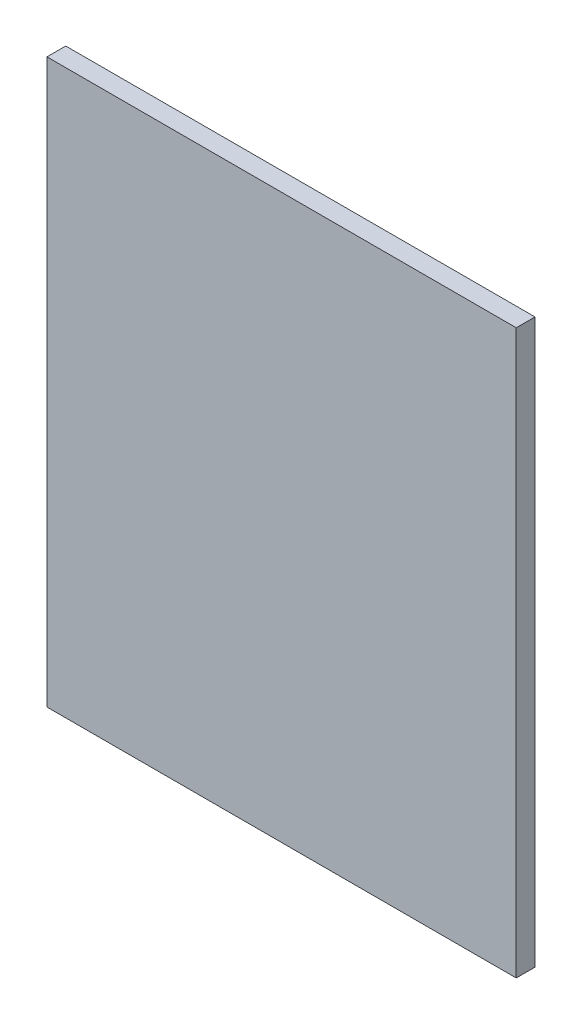
ISO-10303-21;
HEADER;
FILE_DESCRIPTION(('STEP AP214'),'2;1');
FILE_NAME('part.step','',(''),(''),'','','');
FILE_SCHEMA(('AUTOMOTIVE_DESIGN { 1 0 10303 214 1 1 1 1 }'));
ENDSEC;
DATA;
#1=APPLICATION_CONTEXT('core data for automotive mechanical design processes');
#2=APPLICATION_PROTOCOL_DEFINITION('international standard','automotive_design',2000,#1);
#3=PRODUCT_CONTEXT('',#1,'mechanical');
#4=PRODUCT('Part','Part','',(#3));
#5=PRODUCT_RELATED_PRODUCT_CATEGORY('part','',(#4));
#6=PRODUCT_DEFINITION_FORMATION('','',#4);
#7=PRODUCT_DEFINITION_CONTEXT('part definition',#1,'design');
#8=PRODUCT_DEFINITION('design','',#6,#7);
#9=PRODUCT_DEFINITION_SHAPE('','',#8);
#10=(LENGTH_UNIT() NAMED_UNIT(*) SI_UNIT(.MILLI.,.METRE.));
#11=(NAMED_UNIT(*) PLANE_ANGLE_UNIT() SI_UNIT($,.RADIAN.));
#12=(NAMED_UNIT(*) SI_UNIT($,.STERADIAN.) SOLID_ANGLE_UNIT());
#13=UNCERTAINTY_MEASURE_WITH_UNIT(LENGTH_MEASURE(1.E-05),#10,'distance_accuracy_value','');
#14=(GEOMETRIC_REPRESENTATION_CONTEXT(3) GLOBAL_UNCERTAINTY_ASSIGNED_CONTEXT((#13)) GLOBAL_UNIT_ASSIGNED_CONTEXT((#10,
#11,#12)) REPRESENTATION_CONTEXT('',''));
#15=CARTESIAN_POINT('',(0.,0.,0.));
#16=DIRECTION('',(0.,0.,1.));
#17=DIRECTION('',(1.,0.,0.));
#18=AXIS2_PLACEMENT_3D('',#15,#16,#17);
#19=CARTESIAN_POINT('',(0.3,0.15,0.6));
#20=DIRECTION('',(0.,0.,1.));
#21=DIRECTION('',(1.,0.,0.));
#22=AXIS2_PLACEMENT_3D('',#19,#20,#21);
#23=PLANE('',#22);
#24=DIRECTION('',(0.,1.,0.));
#25=VECTOR('',#24,1.);
#26=CARTESIAN_POINT('',(0.55,0.15,0.6));
#27=LINE('',#26,#25);
#28=CARTESIAN_POINT('',(0.55,0.15,0.6));
#29=VERTEX_POINT('',#28);
#30=CARTESIAN_POINT('',(0.55,-0.15,0.6));
#31=VERTEX_POINT('',#30);
#32=EDGE_CURVE('E52',#29,#31,#27,.F.);
#33=ORIENTED_EDGE('',*,*,#32,.F.);
#34=DIRECTION('',(1.,0.,0.));
#35=VECTOR('',#34,1.);
#36=CARTESIAN_POINT('',(0.3,0.15,0.6));
#37=LINE('',#36,#35);
#38=CARTESIAN_POINT('',(0.3,0.15,0.6));
#39=VERTEX_POINT('',#38);
#40=EDGE_CURVE('E67',#39,#29,#37,.T.);
#41=ORIENTED_EDGE('',*,*,#40,.F.);
#42=DIRECTION('',(0.,1.,0.));
#43=VECTOR('',#42,1.);
#44=CARTESIAN_POINT('',(0.3,-0.15,0.6));
#45=LINE('',#44,#43);
#46=CARTESIAN_POINT('',(0.3,-0.15,0.6));
#47=VERTEX_POINT('',#46);
#48=EDGE_CURVE('E19',#47,#39,#45,.T.);
#49=ORIENTED_EDGE('',*,*,#48,.F.);
#50=DIRECTION('',(1.,0.,0.));
#51=VECTOR('',#50,1.);
#52=CARTESIAN_POINT('',(0.55,-0.15,0.6));
#53=LINE('',#52,#51);
#54=EDGE_CURVE('E57',#31,#47,#53,.F.);
#55=ORIENTED_EDGE('',*,*,#54,.F.);
#56=EDGE_LOOP('',(#33,#41,#49,#55));
#57=FACE_BOUND('',#56,.T.);
#58=ADVANCED_FACE('F16',(#57),#23,.T.);
#59=CARTESIAN_POINT('',(0.3,-0.15,0.59));
#60=DIRECTION('',(-1.,0.,0.));
#61=DIRECTION('',(0.,0.,1.));
#62=AXIS2_PLACEMENT_3D('',#59,#60,#61);
#63=PLANE('',#62);
#64=DIRECTION('',(0.,0.,1.));
#65=VECTOR('',#64,1.);
#66=CARTESIAN_POINT('',(0.3,0.15,0.59));
#67=LINE('',#66,#65);
#68=CARTESIAN_POINT('',(0.3,0.15,0.59));
#69=VERTEX_POINT('',#68);
#70=EDGE_CURVE('E78',#69,#39,#67,.T.);
#71=ORIENTED_EDGE('',*,*,#70,.F.);
#72=DIRECTION('',(0.,1.,0.));
#73=VECTOR('',#72,1.);
#74=CARTESIAN_POINT('',(0.3,0.15,0.59));
#75=LINE('',#74,#73);
#76=CARTESIAN_POINT('',(0.3,-0.15,0.59));
#77=VERTEX_POINT('',#76);
#78=EDGE_CURVE('E73',#69,#77,#75,.F.);
#79=ORIENTED_EDGE('',*,*,#78,.T.);
#80=DIRECTION('',(0.,0.,-1.));
#81=VECTOR('',#80,1.);
#82=CARTESIAN_POINT('',(0.3,-0.15,0.59));
#83=LINE('',#82,#81);
#84=EDGE_CURVE('E62',#47,#77,#83,.T.);
#85=ORIENTED_EDGE('',*,*,#84,.F.);
#86=ORIENTED_EDGE('',*,*,#48,.T.);
#87=EDGE_LOOP('',(#71,#79,#85,#86));
#88=FACE_BOUND('',#87,.T.);
#89=ADVANCED_FACE('F72',(#88),#63,.T.);
#90=CARTESIAN_POINT('',(0.55,-0.15,0.59));
#91=DIRECTION('',(0.,-1.,0.));
#92=DIRECTION('',(0.,0.,-1.));
#93=AXIS2_PLACEMENT_3D('',#90,#91,#92);
#94=PLANE('',#93);
#95=ORIENTED_EDGE('',*,*,#84,.T.);
#96=DIRECTION('',(1.,0.,0.));
#97=VECTOR('',#96,1.);
#98=CARTESIAN_POINT('',(0.3,-0.15,0.59));
#99=LINE('',#98,#97);
#100=CARTESIAN_POINT('',(0.55,-0.15,0.59));
#101=VERTEX_POINT('',#100);
#102=EDGE_CURVE('E83',#77,#101,#99,.T.);
#103=ORIENTED_EDGE('',*,*,#102,.T.);
#104=DIRECTION('',(0.,0.,-1.));
#105=VECTOR('',#104,1.);
#106=CARTESIAN_POINT('',(0.55,-0.15,0.59));
#107=LINE('',#106,#105);
#108=EDGE_CURVE('E64',#31,#101,#107,.T.);
#109=ORIENTED_EDGE('',*,*,#108,.F.);
#110=ORIENTED_EDGE('',*,*,#54,.T.);
#111=EDGE_LOOP('',(#95,#103,#109,#110));
#112=FACE_BOUND('',#111,.T.);
#113=ADVANCED_FACE('F59',(#112),#94,.T.);
#114=CARTESIAN_POINT('',(0.55,0.15,0.59));
#115=DIRECTION('',(1.,0.,0.));
#116=DIRECTION('',(0.,0.,-1.));
#117=AXIS2_PLACEMENT_3D('',#114,#115,#116);
#118=PLANE('',#117);
#119=ORIENTED_EDGE('',*,*,#108,.T.);
#120=DIRECTION('',(0.,1.,0.));
#121=VECTOR('',#120,1.);
#122=CARTESIAN_POINT('',(0.55,0.15,0.59));
#123=LINE('',#122,#121);
#124=CARTESIAN_POINT('',(0.55,0.15,0.59));
#125=VERTEX_POINT('',#124);
#126=EDGE_CURVE('E25',#101,#125,#123,.T.);
#127=ORIENTED_EDGE('',*,*,#126,.T.);
#128=DIRECTION('',(0.,0.,1.));
#129=VECTOR('',#128,1.);
#130=CARTESIAN_POINT('',(0.55,0.15,0.59));
#131=LINE('',#130,#129);
#132=EDGE_CURVE('E33',#29,#125,#131,.F.);
#133=ORIENTED_EDGE('',*,*,#132,.F.);
#134=ORIENTED_EDGE('',*,*,#32,.T.);
#135=EDGE_LOOP('',(#119,#127,#133,#134));
#136=FACE_BOUND('',#135,.T.);
#137=ADVANCED_FACE('F87',(#136),#118,.T.);
#138=CARTESIAN_POINT('',(0.3,0.15,0.59));
#139=DIRECTION('',(0.,1.,0.));
#140=DIRECTION('',(0.,0.,1.));
#141=AXIS2_PLACEMENT_3D('',#138,#139,#140);
#142=PLANE('',#141);
#143=ORIENTED_EDGE('',*,*,#132,.T.);
#144=DIRECTION('',(1.,0.,0.));
#145=VECTOR('',#144,1.);
#146=CARTESIAN_POINT('',(0.3,0.15,0.59));
#147=LINE('',#146,#145);
#148=EDGE_CURVE('E10',#125,#69,#147,.F.);
#149=ORIENTED_EDGE('',*,*,#148,.T.);
#150=ORIENTED_EDGE('',*,*,#70,.T.);
#151=ORIENTED_EDGE('',*,*,#40,.T.);
#152=EDGE_LOOP('',(#143,#149,#150,#151));
#153=FACE_BOUND('',#152,.T.);
#154=ADVANCED_FACE('F90',(#153),#142,.T.);
#155=CARTESIAN_POINT('',(0.3,0.15,0.59));
#156=DIRECTION('',(0.,0.,1.));
#157=DIRECTION('',(1.,0.,0.));
#158=AXIS2_PLACEMENT_3D('',#155,#156,#157);
#159=PLANE('',#158);
#160=ORIENTED_EDGE('',*,*,#126,.F.);
#161=ORIENTED_EDGE('',*,*,#102,.F.);
#162=ORIENTED_EDGE('',*,*,#78,.F.);
#163=ORIENTED_EDGE('',*,*,#148,.F.);
#164=EDGE_LOOP('',(#160,#161,#162,#163));
#165=FACE_BOUND('',#164,.T.);
#166=ADVANCED_FACE('F89',(#165),#159,.F.);
#167=CLOSED_SHELL('',(#58,#89,#113,#137,#154,#166));
#168=MANIFOLD_SOLID_BREP('B1',#167);
#169=ADVANCED_BREP_SHAPE_REPRESENTATION('',(#18,#168),#14);
#170=SHAPE_DEFINITION_REPRESENTATION(#9,#169);
ENDSEC;
END-ISO-10303-21;
